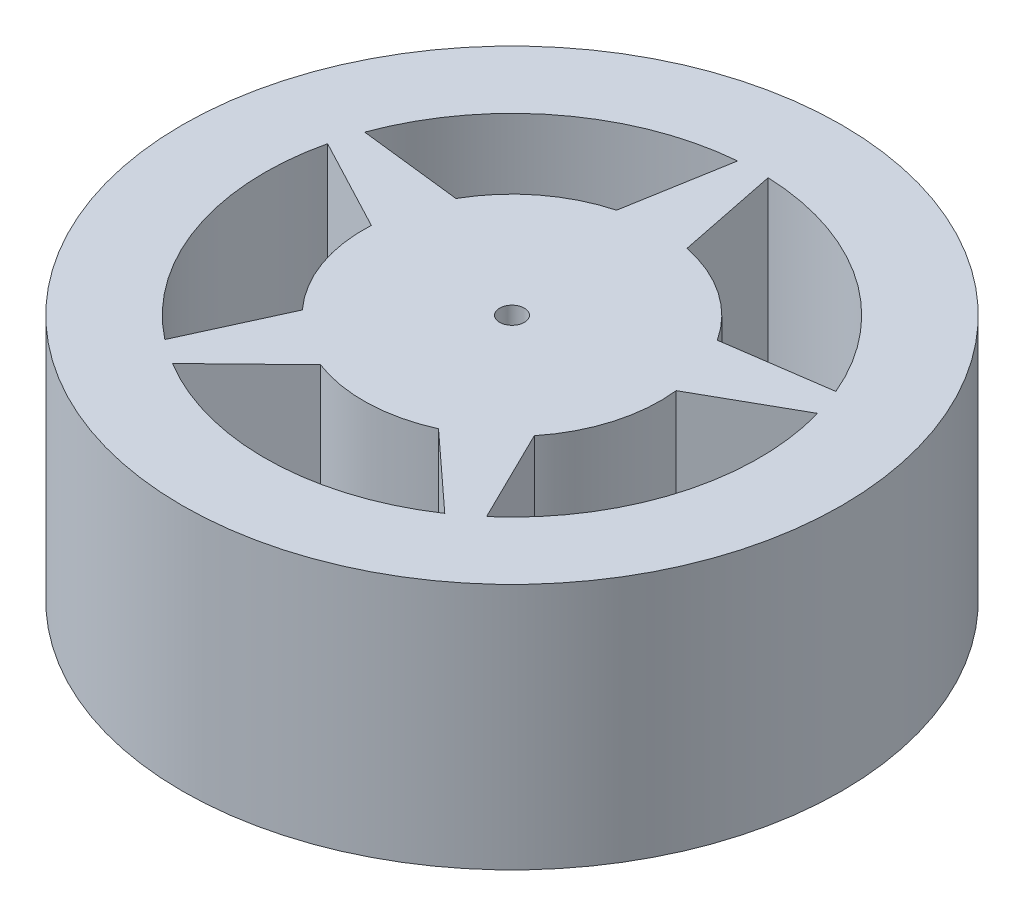
ISO-10303-21;
HEADER;
FILE_DESCRIPTION(('STEP AP214'),'2;1');
FILE_NAME('part.step','',(''),(''),'','','');
FILE_SCHEMA(('AUTOMOTIVE_DESIGN { 1 0 10303 214 1 1 1 1 }'));
ENDSEC;
DATA;
#1=APPLICATION_CONTEXT('core data for automotive mechanical design processes');
#2=APPLICATION_PROTOCOL_DEFINITION('international standard','automotive_design',2000,#1);
#3=PRODUCT_CONTEXT('',#1,'mechanical');
#4=PRODUCT('Part','Part','',(#3));
#5=PRODUCT_RELATED_PRODUCT_CATEGORY('part','',(#4));
#6=PRODUCT_DEFINITION_FORMATION('','',#4);
#7=PRODUCT_DEFINITION_CONTEXT('part definition',#1,'design');
#8=PRODUCT_DEFINITION('design','',#6,#7);
#9=PRODUCT_DEFINITION_SHAPE('','',#8);
#10=(LENGTH_UNIT() NAMED_UNIT(*) SI_UNIT(.MILLI.,.METRE.));
#11=(NAMED_UNIT(*) PLANE_ANGLE_UNIT() SI_UNIT($,.RADIAN.));
#12=(NAMED_UNIT(*) SI_UNIT($,.STERADIAN.) SOLID_ANGLE_UNIT());
#13=UNCERTAINTY_MEASURE_WITH_UNIT(LENGTH_MEASURE(1.E-05),#10,'distance_accuracy_value','');
#14=(GEOMETRIC_REPRESENTATION_CONTEXT(3) GLOBAL_UNCERTAINTY_ASSIGNED_CONTEXT((#13)) GLOBAL_UNIT_ASSIGNED_CONTEXT((#10,
#11,#12)) REPRESENTATION_CONTEXT('',''));
#15=CARTESIAN_POINT('',(0.,0.,0.));
#16=DIRECTION('',(0.,0.,1.));
#17=DIRECTION('',(1.,0.,0.));
#18=AXIS2_PLACEMENT_3D('',#15,#16,#17);
#19=CARTESIAN_POINT('',(0.,30.,0.));
#20=DIRECTION('',(0.,-1.,0.));
#21=DIRECTION('',(0.,0.,-1.));
#22=AXIS2_PLACEMENT_3D('',#19,#20,#21);
#23=CYLINDRICAL_SURFACE('',#22,40.);
#24=CARTESIAN_POINT('',(0.,30.,0.));
#25=DIRECTION('',(0.,1.,0.));
#26=DIRECTION('',(0.,0.,1.));
#27=AXIS2_PLACEMENT_3D('',#24,#25,#26);
#28=CIRCLE('',#27,40.);
#29=CARTESIAN_POINT('',(0.,30.,40.));
#30=VERTEX_POINT('',#29);
#31=EDGE_CURVE('E375',#30,#30,#28,.T.);
#32=ORIENTED_EDGE('',*,*,#31,.F.);
#33=EDGE_LOOP('',(#32));
#34=FACE_BOUND('',#33,.T.);
#35=CARTESIAN_POINT('',(0.,0.,0.));
#36=DIRECTION('',(0.,1.,0.));
#37=DIRECTION('',(0.,0.,1.));
#38=AXIS2_PLACEMENT_3D('',#35,#36,#37);
#39=CIRCLE('',#38,40.);
#40=CARTESIAN_POINT('',(0.,0.,40.));
#41=VERTEX_POINT('',#40);
#42=EDGE_CURVE('E365',#41,#41,#39,.T.);
#43=ORIENTED_EDGE('',*,*,#42,.T.);
#44=EDGE_LOOP('',(#43));
#45=FACE_BOUND('',#44,.T.);
#46=ADVANCED_FACE('F91',(#34,#45),#23,.T.);
#47=CARTESIAN_POINT('',(0.,30.,0.));
#48=DIRECTION('',(0.,1.,0.));
#49=DIRECTION('',(0.,0.,1.));
#50=AXIS2_PLACEMENT_3D('',#47,#48,#49);
#51=PLANE('',#50);
#52=CARTESIAN_POINT('',(0.,30.,0.));
#53=DIRECTION('',(0.,1.,0.));
#54=DIRECTION('',(0.,0.,1.));
#55=AXIS2_PLACEMENT_3D('',#52,#53,#54);
#56=CIRCLE('',#55,1.5);
#57=CARTESIAN_POINT('',(0.,30.,1.5));
#58=VERTEX_POINT('',#57);
#59=EDGE_CURVE('E766',#58,#58,#56,.T.);
#60=ORIENTED_EDGE('',*,*,#59,.F.);
#61=EDGE_LOOP('',(#60));
#62=FACE_BOUND('',#61,.T.);
#63=CARTESIAN_POINT('',(0.,30.,0.));
#64=DIRECTION('',(0.,1.,0.));
#65=DIRECTION('',(0.,0.,1.));
#66=AXIS2_PLACEMENT_3D('',#63,#64,#65);
#67=CIRCLE('',#66,29.9999999999999);
#68=CARTESIAN_POINT('',(27.6504964331646,30.,-11.6383008639378));
#69=VERTEX_POINT('',#68);
#70=CARTESIAN_POINT('',(1.09068254426184,30.,-29.9801669706432));
#71=VERTEX_POINT('',#70);
#72=EDGE_CURVE('E107',#69,#71,#67,.T.);
#73=ORIENTED_EDGE('',*,*,#72,.F.);
#74=DIRECTION('',(-0.989829319875597,0.,0.142260034846804));
#75=VECTOR('',#74,1.);
#76=CARTESIAN_POINT('',(27.6504964331646,30.,-11.6383008639378));
#77=LINE('',#76,#75);
#78=CARTESIAN_POINT('',(15.0779481878618,30.,-9.83135181163586));
#79=VERTEX_POINT('',#78);
#80=EDGE_CURVE('E298',#69,#79,#77,.T.);
#81=ORIENTED_EDGE('',*,*,#80,.T.);
#82=CARTESIAN_POINT('',(0.,30.,0.));
#83=DIRECTION('',(0.,1.,0.));
#84=DIRECTION('',(0.,0.,1.));
#85=AXIS2_PLACEMENT_3D('',#82,#83,#84);
#86=CIRCLE('',#85,18.);
#87=CARTESIAN_POINT('',(3.58921236170057,30.,-17.6385247292004));
#88=VERTEX_POINT('',#87);
#89=EDGE_CURVE('E311',#79,#88,#86,.T.);
#90=ORIENTED_EDGE('',*,*,#89,.T.);
#91=DIRECTION('',(0.198421798962708,0.,0.980116722485849));
#92=VECTOR('',#91,1.);
#93=CARTESIAN_POINT('',(1.09068254426184,30.,-29.9801669706432));
#94=LINE('',#93,#92);
#95=EDGE_CURVE('E315',#71,#88,#94,.T.);
#96=ORIENTED_EDGE('',*,*,#95,.F.);
#97=EDGE_LOOP('',(#73,#81,#90,#96));
#98=FACE_BOUND('',#97,.T.);
#99=CARTESIAN_POINT('',(0.,30.,0.));
#100=DIRECTION('',(0.,1.,0.));
#101=DIRECTION('',(0.,0.,1.));
#102=AXIS2_PLACEMENT_3D('',#99,#100,#101);
#103=CIRCLE('',#102,29.9999999999998);
#104=CARTESIAN_POINT('',(19.6131551760033,30.,22.7007520589517));
#105=VERTEX_POINT('',#104);
#106=CARTESIAN_POINT('',(28.8498725986917,30.,-8.22708034719749));
#107=VERTEX_POINT('',#106);
#108=EDGE_CURVE('E115',#105,#107,#103,.T.);
#109=ORIENTED_EDGE('',*,*,#108,.F.);
#110=DIRECTION('',(-0.441171414521584,0.,-0.897422856299651));
#111=VECTOR('',#110,1.);
#112=CARTESIAN_POINT('',(19.6131551760033,30.,22.7007520589517));
#113=LINE('',#112,#111);
#114=CARTESIAN_POINT('',(14.0095134348007,30.,11.3019260889522));
#115=VERTEX_POINT('',#114);
#116=EDGE_CURVE('E325',#105,#115,#113,.T.);
#117=ORIENTED_EDGE('',*,*,#116,.T.);
#118=CARTESIAN_POINT('',(0.,30.,0.));
#119=DIRECTION('',(0.,1.,0.));
#120=DIRECTION('',(0.,0.,1.));
#121=AXIS2_PLACEMENT_3D('',#118,#119,#120);
#122=CIRCLE('',#121,18.);
#123=CARTESIAN_POINT('',(17.8843614977254,30.,-2.03706009206327));
#124=VERTEX_POINT('',#123);
#125=EDGE_CURVE('E337',#115,#124,#122,.T.);
#126=ORIENTED_EDGE('',*,*,#125,.T.);
#127=DIRECTION('',(-0.87083068771609,0.,0.491583068597691));
#128=VECTOR('',#127,1.);
#129=CARTESIAN_POINT('',(28.8498725986917,30.,-8.22708034719749));
#130=LINE('',#129,#128);
#131=EDGE_CURVE('E341',#107,#124,#130,.T.);
#132=ORIENTED_EDGE('',*,*,#131,.F.);
#133=EDGE_LOOP('',(#109,#117,#126,#132));
#134=FACE_BOUND('',#133,.T.);
#135=CARTESIAN_POINT('',(0.,30.,0.));
#136=DIRECTION('',(0.,1.,0.));
#137=DIRECTION('',(0.,0.,1.));
#138=AXIS2_PLACEMENT_3D('',#135,#136,#137);
#139=CIRCLE('',#138,29.9999999999998);
#140=CARTESIAN_POINT('',(-29.2105431268995,30.,-6.83697083740547));
#141=VERTEX_POINT('',#140);
#142=CARTESIAN_POINT('',(-18.5042807203858,30.,23.6133774589986));
#143=VERTEX_POINT('',#142);
#144=EDGE_CURVE('E235',#141,#143,#139,.T.);
#145=ORIENTED_EDGE('',*,*,#144,.F.);
#146=DIRECTION('',(0.884407091783518,0.,0.466716290698128));
#147=VECTOR('',#146,1.);
#148=CARTESIAN_POINT('',(-29.2105431268995,30.,-6.83697083740547));
#149=LINE('',#148,#147);
#150=CARTESIAN_POINT('',(-17.9770399292636,30.,-0.908864886362832));
#151=VERTEX_POINT('',#150);
#152=EDGE_CURVE('E245',#141,#151,#149,.T.);
#153=ORIENTED_EDGE('',*,*,#152,.T.);
#154=CARTESIAN_POINT('',(0.,30.,0.));
#155=DIRECTION('',(0.,1.,0.));
#156=DIRECTION('',(0.,0.,1.));
#157=AXIS2_PLACEMENT_3D('',#154,#155,#156);
#158=CIRCLE('',#157,18.);
#159=CARTESIAN_POINT('',(-13.2713985050565,30.,12.1601801680725));
#160=VERTEX_POINT('',#159);
#161=EDGE_CURVE('E252',#151,#160,#158,.T.);
#162=ORIENTED_EDGE('',*,*,#161,.T.);
#163=DIRECTION('',(0.415571547587138,0.,-0.909560492125747));
#164=VECTOR('',#163,1.);
#165=CARTESIAN_POINT('',(-18.5042807203858,30.,23.6133774589986));
#166=LINE('',#165,#164);
#167=EDGE_CURVE('E259',#143,#160,#166,.T.);
#168=ORIENTED_EDGE('',*,*,#167,.F.);
#169=EDGE_LOOP('',(#145,#153,#162,#168));
#170=FACE_BOUND('',#169,.T.);
#171=CARTESIAN_POINT('',(0.,30.,0.));
#172=DIRECTION('',(0.,1.,0.));
#173=DIRECTION('',(0.,0.,1.));
#174=AXIS2_PLACEMENT_3D('',#171,#172,#173);
#175=CIRCLE('',#174,29.9999999999998);
#176=CARTESIAN_POINT('',(-15.5288999077687,30.,25.6681372065541));
#177=VERTEX_POINT('',#176);
#178=CARTESIAN_POINT('',(16.7395192928338,30.,24.8955516878986));
#179=VERTEX_POINT('',#178);
#180=EDGE_CURVE('E291',#177,#179,#175,.T.);
#181=ORIENTED_EDGE('',*,*,#180,.F.);
#182=DIRECTION('',(0.717170390836389,0.,-0.696897862321001));
#183=VECTOR('',#182,1.);
#184=CARTESIAN_POINT('',(-15.5288999077687,30.,25.6681372065541));
#185=LINE('',#184,#183);
#186=CARTESIAN_POINT('',(-6.41959271930667,30.,16.8163262729475));
#187=VERTEX_POINT('',#186);
#188=EDGE_CURVE('E274',#177,#187,#185,.T.);
#189=ORIENTED_EDGE('',*,*,#188,.T.);
#190=CARTESIAN_POINT('',(0.,30.,0.));
#191=DIRECTION('',(0.,1.,0.));
#192=DIRECTION('',(0.,0.,1.));
#193=AXIS2_PLACEMENT_3D('',#190,#191,#192);
#194=CIRCLE('',#193,18.);
#195=CARTESIAN_POINT('',(7.46393091098371,30.,16.3795523551794));
#196=VERTEX_POINT('',#195);
#197=EDGE_CURVE('E283',#187,#196,#194,.T.);
#198=ORIENTED_EDGE('',*,*,#197,.T.);
#199=DIRECTION('',(-0.736624762417696,0.,-0.676301677798505));
#200=VECTOR('',#199,1.);
#201=CARTESIAN_POINT('',(16.7395192928338,30.,24.8955516878986));
#202=LINE('',#201,#200);
#203=EDGE_CURVE('E287',#179,#196,#202,.T.);
#204=ORIENTED_EDGE('',*,*,#203,.F.);
#205=EDGE_LOOP('',(#181,#189,#198,#204));
#206=FACE_BOUND('',#205,.T.);
#207=CARTESIAN_POINT('',(0.,30.,0.));
#208=DIRECTION('',(0.,1.,0.));
#209=DIRECTION('',(0.,0.,1.));
#210=AXIS2_PLACEMENT_3D('',#207,#208,#209);
#211=CIRCLE('',#210,29.9999999999999);
#212=CARTESIAN_POINT('',(-2.5242085744998,30.,-29.8936175641628));
#213=VERTEX_POINT('',#212);
#214=CARTESIAN_POINT('',(-28.1757937154017,30.,-10.3016818290568));
#215=VERTEX_POINT('',#214);
#216=EDGE_CURVE('E321',#213,#215,#211,.T.);
#217=ORIENTED_EDGE('',*,*,#216,.F.);
#218=DIRECTION('',(-0.170576748222727,0.,0.985344393075721));
#219=VECTOR('',#218,1.);
#220=CARTESIAN_POINT('',(-2.5242085744998,30.,-29.8936175641628));
#221=LINE('',#220,#219);
#222=CARTESIAN_POINT('',(-4.69082897409221,30.,-17.3780356639011));
#223=VERTEX_POINT('',#222);
#224=EDGE_CURVE('E357',#213,#223,#221,.T.);
#225=ORIENTED_EDGE('',*,*,#224,.T.);
#226=CARTESIAN_POINT('',(0.,30.,0.));
#227=DIRECTION('',(0.,1.,0.));
#228=DIRECTION('',(0.,0.,1.));
#229=AXIS2_PLACEMENT_3D('',#226,#227,#228);
#230=CIRCLE('',#229,18.);
#231=CARTESIAN_POINT('',(-15.6661062653532,30.,-8.86414770198815));
#232=VERTEX_POINT('',#231);
#233=EDGE_CURVE('E353',#223,#232,#230,.T.);
#234=ORIENTED_EDGE('',*,*,#233,.T.);
#235=DIRECTION('',(0.993462103583941,0.,0.114162378840712));
#236=VECTOR('',#235,1.);
#237=CARTESIAN_POINT('',(-28.1757937154017,30.,-10.3016818290568));
#238=LINE('',#237,#236);
#239=EDGE_CURVE('E349',#215,#232,#238,.T.);
#240=ORIENTED_EDGE('',*,*,#239,.F.);
#241=EDGE_LOOP('',(#217,#225,#234,#240));
#242=FACE_BOUND('',#241,.T.);
#243=ORIENTED_EDGE('',*,*,#31,.T.);
#244=EDGE_LOOP('',(#243));
#245=FACE_BOUND('',#244,.T.);
#246=ADVANCED_FACE('F256',(#62,#98,#134,#170,#206,#242,#245),#51,.T.);
#247=CARTESIAN_POINT('',(0.,0.,0.));
#248=DIRECTION('',(0.,1.,0.));
#249=DIRECTION('',(0.,0.,1.));
#250=AXIS2_PLACEMENT_3D('',#247,#248,#249);
#251=PLANE('',#250);
#252=CARTESIAN_POINT('',(0.,0.,0.));
#253=DIRECTION('',(0.,1.,0.));
#254=DIRECTION('',(0.,0.,1.));
#255=AXIS2_PLACEMENT_3D('',#252,#253,#254);
#256=CIRCLE('',#255,1.5);
#257=CARTESIAN_POINT('',(0.,0.,1.5));
#258=VERTEX_POINT('',#257);
#259=EDGE_CURVE('E94',#258,#258,#256,.T.);
#260=ORIENTED_EDGE('',*,*,#259,.T.);
#261=EDGE_LOOP('',(#260));
#262=FACE_BOUND('',#261,.T.);
#263=DIRECTION('',(-0.989829319875597,0.,0.142260034846804));
#264=VECTOR('',#263,1.);
#265=CARTESIAN_POINT('',(-1.07923738042133,0.,-7.50921229140109));
#266=LINE('',#265,#264);
#267=CARTESIAN_POINT('',(27.6504964331646,0.,-11.6383008639378));
#268=VERTEX_POINT('',#267);
#269=CARTESIAN_POINT('',(15.0779481878618,0.,-9.83135181163586));
#270=VERTEX_POINT('',#269);
#271=EDGE_CURVE('E100',#268,#270,#266,.T.);
#272=ORIENTED_EDGE('',*,*,#271,.F.);
#273=CARTESIAN_POINT('',(0.,0.,0.));
#274=DIRECTION('',(0.,1.,0.));
#275=DIRECTION('',(0.,0.,1.));
#276=AXIS2_PLACEMENT_3D('',#273,#274,#275);
#277=CIRCLE('',#276,29.9999999999999);
#278=CARTESIAN_POINT('',(1.09068254426184,0.,-29.9801669706432));
#279=VERTEX_POINT('',#278);
#280=EDGE_CURVE('E12',#268,#279,#277,.T.);
#281=ORIENTED_EDGE('',*,*,#280,.T.);
#282=DIRECTION('',(0.198421798962708,0.,0.980116722485849));
#283=VECTOR('',#282,1.);
#284=CARTESIAN_POINT('',(6.8781796919143,0.,-1.39246760793647));
#285=LINE('',#284,#283);
#286=CARTESIAN_POINT('',(3.58921236170057,0.,-17.6385247292004));
#287=VERTEX_POINT('',#286);
#288=EDGE_CURVE('E440',#279,#287,#285,.T.);
#289=ORIENTED_EDGE('',*,*,#288,.T.);
#290=CARTESIAN_POINT('',(0.,0.,0.));
#291=DIRECTION('',(0.,1.,0.));
#292=DIRECTION('',(0.,0.,1.));
#293=AXIS2_PLACEMENT_3D('',#290,#291,#292);
#294=CIRCLE('',#293,18.);
#295=EDGE_CURVE('E444',#270,#287,#294,.T.);
#296=ORIENTED_EDGE('',*,*,#295,.F.);
#297=EDGE_LOOP('',(#272,#281,#289,#296));
#298=FACE_BOUND('',#297,.T.);
#299=DIRECTION('',(-0.441171414521584,0.,-0.897422856299651));
#300=VECTOR('',#299,1.);
#301=CARTESIAN_POINT('',(6.80818259046577,0.,-3.34688995569119));
#302=LINE('',#301,#300);
#303=CARTESIAN_POINT('',(19.6131551760033,0.,22.7007520589517));
#304=VERTEX_POINT('',#303);
#305=CARTESIAN_POINT('',(14.0095134348007,0.,11.3019260889522));
#306=VERTEX_POINT('',#305);
#307=EDGE_CURVE('E433',#304,#306,#302,.T.);
#308=ORIENTED_EDGE('',*,*,#307,.F.);
#309=CARTESIAN_POINT('',(0.,0.,0.));
#310=DIRECTION('',(0.,1.,0.));
#311=DIRECTION('',(0.,0.,1.));
#312=AXIS2_PLACEMENT_3D('',#309,#310,#311);
#313=CIRCLE('',#312,29.9999999999998);
#314=CARTESIAN_POINT('',(28.8498725986917,0.,-8.22708034719749));
#315=VERTEX_POINT('',#314);
#316=EDGE_CURVE('E436',#304,#315,#313,.T.);
#317=ORIENTED_EDGE('',*,*,#316,.T.);
#318=DIRECTION('',(-0.87083068771609,0.,0.491583068597691));
#319=VECTOR('',#318,1.);
#320=CARTESIAN_POINT('',(3.44978980742405,0.,6.11124146127508));
#321=LINE('',#320,#319);
#322=CARTESIAN_POINT('',(17.8843614977254,0.,-2.03706009206326));
#323=VERTEX_POINT('',#322);
#324=EDGE_CURVE('E425',#315,#323,#321,.T.);
#325=ORIENTED_EDGE('',*,*,#324,.T.);
#326=CARTESIAN_POINT('',(0.,0.,0.));
#327=DIRECTION('',(0.,1.,0.));
#328=DIRECTION('',(0.,0.,1.));
#329=AXIS2_PLACEMENT_3D('',#326,#327,#328);
#330=CIRCLE('',#329,18.);
#331=EDGE_CURVE('E429',#306,#323,#330,.T.);
#332=ORIENTED_EDGE('',*,*,#331,.F.);
#333=EDGE_LOOP('',(#308,#317,#325,#332));
#334=FACE_BOUND('',#333,.T.);
#335=DIRECTION('',(0.884407091783518,0.,0.466716290698128));
#336=VECTOR('',#335,1.);
#337=CARTESIAN_POINT('',(-3.54068285949337,0.,6.70944017404714));
#338=LINE('',#337,#336);
#339=CARTESIAN_POINT('',(-29.2105431268995,0.,-6.83697083740547));
#340=VERTEX_POINT('',#339);
#341=CARTESIAN_POINT('',(-17.9770399292636,0.,-0.908864886362832));
#342=VERTEX_POINT('',#341);
#343=EDGE_CURVE('E420',#340,#342,#338,.T.);
#344=ORIENTED_EDGE('',*,*,#343,.F.);
#345=CARTESIAN_POINT('',(0.,0.,0.));
#346=DIRECTION('',(0.,1.,0.));
#347=DIRECTION('',(0.,0.,1.));
#348=AXIS2_PLACEMENT_3D('',#345,#346,#347);
#349=CIRCLE('',#348,29.9999999999998);
#350=CARTESIAN_POINT('',(-18.5042807203858,0.,23.6133774589986));
#351=VERTEX_POINT('',#350);
#352=EDGE_CURVE('E238',#340,#351,#349,.T.);
#353=ORIENTED_EDGE('',*,*,#352,.T.);
#354=DIRECTION('',(0.415571547587138,0.,-0.909560492125747));
#355=VECTOR('',#354,1.);
#356=CARTESIAN_POINT('',(-6.38303618536332,0.,-2.91636262658758));
#357=LINE('',#356,#355);
#358=CARTESIAN_POINT('',(-13.2713985050565,0.,12.1601801680725));
#359=VERTEX_POINT('',#358);
#360=EDGE_CURVE('E412',#351,#359,#357,.T.);
#361=ORIENTED_EDGE('',*,*,#360,.T.);
#362=CARTESIAN_POINT('',(0.,0.,0.));
#363=DIRECTION('',(0.,1.,0.));
#364=DIRECTION('',(0.,0.,1.));
#365=AXIS2_PLACEMENT_3D('',#362,#363,#364);
#366=CIRCLE('',#365,18.);
#367=EDGE_CURVE('E416',#342,#359,#366,.T.);
#368=ORIENTED_EDGE('',*,*,#367,.F.);
#369=EDGE_LOOP('',(#344,#353,#361,#368));
#370=FACE_BOUND('',#369,.T.);
#371=DIRECTION('',(0.717170390836389,0.,-0.696897862321001));
#372=VECTOR('',#371,1.);
#373=CARTESIAN_POINT('',(5.28692562294449,0.,5.4407205421783));
#374=LINE('',#373,#372);
#375=CARTESIAN_POINT('',(-15.5288999077687,0.,25.6681372065541));
#376=VERTEX_POINT('',#375);
#377=CARTESIAN_POINT('',(-6.41959271930667,0.,16.8163262729475));
#378=VERTEX_POINT('',#377);
#379=EDGE_CURVE('E405',#376,#378,#374,.T.);
#380=ORIENTED_EDGE('',*,*,#379,.F.);
#381=CARTESIAN_POINT('',(0.,0.,0.));
#382=DIRECTION('',(0.,1.,0.));
#383=DIRECTION('',(0.,0.,1.));
#384=AXIS2_PLACEMENT_3D('',#381,#382,#383);
#385=CIRCLE('',#384,29.9999999999998);
#386=CARTESIAN_POINT('',(16.7395192928338,0.,24.8955516878986));
#387=VERTEX_POINT('',#386);
#388=EDGE_CURVE('E408',#376,#387,#385,.T.);
#389=ORIENTED_EDGE('',*,*,#388,.T.);
#390=DIRECTION('',(-0.736624762417696,0.,-0.676301677798505));
#391=VECTOR('',#390,1.);
#392=CARTESIAN_POINT('',(-4.74609233688327,0.,5.16942254446203));
#393=LINE('',#392,#391);
#394=CARTESIAN_POINT('',(7.46393091098371,0.,16.3795523551794));
#395=VERTEX_POINT('',#394);
#396=EDGE_CURVE('E397',#387,#395,#393,.T.);
#397=ORIENTED_EDGE('',*,*,#396,.T.);
#398=CARTESIAN_POINT('',(0.,0.,0.));
#399=DIRECTION('',(0.,1.,0.));
#400=DIRECTION('',(0.,0.,1.));
#401=AXIS2_PLACEMENT_3D('',#398,#399,#400);
#402=CIRCLE('',#401,18.);
#403=EDGE_CURVE('E401',#378,#395,#402,.T.);
#404=ORIENTED_EDGE('',*,*,#403,.F.);
#405=EDGE_LOOP('',(#380,#389,#397,#404));
#406=FACE_BOUND('',#405,.T.);
#407=DIRECTION('',(-0.170576748222727,0.,0.985344393075721));
#408=VECTOR('',#407,1.);
#409=CARTESIAN_POINT('',(-7.47518797349555,0.,-1.29405846913316));
#410=LINE('',#409,#408);
#411=CARTESIAN_POINT('',(-2.5242085744998,0.,-29.8936175641628));
#412=VERTEX_POINT('',#411);
#413=CARTESIAN_POINT('',(-4.69082897409221,0.,-17.3780356639011));
#414=VERTEX_POINT('',#413);
#415=EDGE_CURVE('E390',#412,#414,#410,.T.);
#416=ORIENTED_EDGE('',*,*,#415,.F.);
#417=CARTESIAN_POINT('',(0.,0.,0.));
#418=DIRECTION('',(0.,1.,0.));
#419=DIRECTION('',(0.,0.,1.));
#420=AXIS2_PLACEMENT_3D('',#417,#418,#419);
#421=CIRCLE('',#420,29.9999999999999);
#422=CARTESIAN_POINT('',(-28.1757937154017,0.,-10.3016818290568));
#423=VERTEX_POINT('',#422);
#424=EDGE_CURVE('E393',#412,#423,#421,.T.);
#425=ORIENTED_EDGE('',*,*,#424,.T.);
#426=DIRECTION('',(0.993462103583941,0.,0.114162378840712));
#427=VECTOR('',#426,1.);
#428=CARTESIAN_POINT('',(0.801159022908259,0.,-6.97183377121307));
#429=LINE('',#428,#427);
#430=CARTESIAN_POINT('',(-15.6661062653532,0.,-8.86414770198815));
#431=VERTEX_POINT('',#430);
#432=EDGE_CURVE('E379',#423,#431,#429,.T.);
#433=ORIENTED_EDGE('',*,*,#432,.T.);
#434=CARTESIAN_POINT('',(0.,0.,0.));
#435=DIRECTION('',(0.,1.,0.));
#436=DIRECTION('',(0.,0.,1.));
#437=AXIS2_PLACEMENT_3D('',#434,#435,#436);
#438=CIRCLE('',#437,18.);
#439=EDGE_CURVE('E386',#414,#431,#438,.T.);
#440=ORIENTED_EDGE('',*,*,#439,.F.);
#441=EDGE_LOOP('',(#416,#425,#433,#440));
#442=FACE_BOUND('',#441,.T.);
#443=ORIENTED_EDGE('',*,*,#42,.F.);
#444=EDGE_LOOP('',(#443));
#445=FACE_BOUND('',#444,.T.);
#446=ADVANCED_FACE('F460',(#262,#298,#334,#370,#406,#442,#445),#251,.F.);
#447=CARTESIAN_POINT('',(0.,-10.,0.));
#448=DIRECTION('',(0.,1.,0.));
#449=DIRECTION('',(0.,0.,1.));
#450=AXIS2_PLACEMENT_3D('',#447,#448,#449);
#451=CYLINDRICAL_SURFACE('',#450,29.9999999999999);
#452=DIRECTION('',(0.,1.,0.));
#453=VECTOR('',#452,1.);
#454=CARTESIAN_POINT('',(-2.5242085744998,-10.,-29.8936175641628));
#455=LINE('',#454,#453);
#456=EDGE_CURVE('E362',#412,#213,#455,.T.);
#457=ORIENTED_EDGE('',*,*,#456,.T.);
#458=ORIENTED_EDGE('',*,*,#216,.T.);
#459=DIRECTION('',(0.,1.,0.));
#460=VECTOR('',#459,1.);
#461=CARTESIAN_POINT('',(-28.1757937154017,-10.,-10.3016818290568));
#462=LINE('',#461,#460);
#463=EDGE_CURVE('E361',#423,#215,#462,.T.);
#464=ORIENTED_EDGE('',*,*,#463,.F.);
#465=ORIENTED_EDGE('',*,*,#424,.F.);
#466=EDGE_LOOP('',(#457,#458,#464,#465));
#467=FACE_BOUND('',#466,.T.);
#468=ADVANCED_FACE('F503',(#467),#451,.F.);
#469=CARTESIAN_POINT('',(-2.5242085744998,-10.,-29.8936175641628));
#470=DIRECTION('',(-0.985344393075721,0.,-0.170576748222727));
#471=DIRECTION('',(-0.170576748222727,0.,0.985344393075721));
#472=AXIS2_PLACEMENT_3D('',#469,#470,#471);
#473=PLANE('',#472);
#474=ORIENTED_EDGE('',*,*,#415,.T.);
#475=DIRECTION('',(0.,1.,0.));
#476=VECTOR('',#475,1.);
#477=CARTESIAN_POINT('',(-4.69082897409221,-10.,-17.3780356639011));
#478=LINE('',#477,#476);
#479=EDGE_CURVE('E366',#414,#223,#478,.T.);
#480=ORIENTED_EDGE('',*,*,#479,.T.);
#481=ORIENTED_EDGE('',*,*,#224,.F.);
#482=ORIENTED_EDGE('',*,*,#456,.F.);
#483=EDGE_LOOP('',(#474,#480,#481,#482));
#484=FACE_BOUND('',#483,.T.);
#485=ADVANCED_FACE('F508',(#484),#473,.T.);
#486=CARTESIAN_POINT('',(0.,-10.,0.));
#487=DIRECTION('',(0.,1.,0.));
#488=DIRECTION('',(0.,0.,1.));
#489=AXIS2_PLACEMENT_3D('',#486,#487,#488);
#490=CYLINDRICAL_SURFACE('',#489,18.);
#491=ORIENTED_EDGE('',*,*,#439,.T.);
#492=DIRECTION('',(0.,1.,0.));
#493=VECTOR('',#492,1.);
#494=CARTESIAN_POINT('',(-15.6661062653532,-10.,-8.86414770198815));
#495=LINE('',#494,#493);
#496=EDGE_CURVE('E369',#431,#232,#495,.T.);
#497=ORIENTED_EDGE('',*,*,#496,.T.);
#498=ORIENTED_EDGE('',*,*,#233,.F.);
#499=ORIENTED_EDGE('',*,*,#479,.F.);
#500=EDGE_LOOP('',(#491,#497,#498,#499));
#501=FACE_BOUND('',#500,.T.);
#502=ADVANCED_FACE('F517',(#501),#490,.T.);
#503=CARTESIAN_POINT('',(-28.1757937154017,-10.,-10.3016818290568));
#504=DIRECTION('',(-0.114162378840712,0.,0.993462103583941));
#505=DIRECTION('',(0.993462103583941,0.,0.114162378840712));
#506=AXIS2_PLACEMENT_3D('',#503,#504,#505);
#507=PLANE('',#506);
#508=ORIENTED_EDGE('',*,*,#463,.T.);
#509=ORIENTED_EDGE('',*,*,#239,.T.);
#510=ORIENTED_EDGE('',*,*,#496,.F.);
#511=ORIENTED_EDGE('',*,*,#432,.F.);
#512=EDGE_LOOP('',(#508,#509,#510,#511));
#513=FACE_BOUND('',#512,.T.);
#514=ADVANCED_FACE('F513',(#513),#507,.F.);
#515=CARTESIAN_POINT('',(0.,-10.,0.));
#516=DIRECTION('',(0.,1.,0.));
#517=DIRECTION('',(0.,0.,1.));
#518=AXIS2_PLACEMENT_3D('',#515,#516,#517);
#519=CYLINDRICAL_SURFACE('',#518,29.9999999999998);
#520=DIRECTION('',(0.,1.,0.));
#521=VECTOR('',#520,1.);
#522=CARTESIAN_POINT('',(-15.5288999077687,-10.,25.6681372065541));
#523=LINE('',#522,#521);
#524=EDGE_CURVE('E261',#376,#177,#523,.T.);
#525=ORIENTED_EDGE('',*,*,#524,.T.);
#526=ORIENTED_EDGE('',*,*,#180,.T.);
#527=DIRECTION('',(0.,1.,0.));
#528=VECTOR('',#527,1.);
#529=CARTESIAN_POINT('',(16.7395192928338,-10.,24.8955516878986));
#530=LINE('',#529,#528);
#531=EDGE_CURVE('E270',#387,#179,#530,.T.);
#532=ORIENTED_EDGE('',*,*,#531,.F.);
#533=ORIENTED_EDGE('',*,*,#388,.F.);
#534=EDGE_LOOP('',(#525,#526,#532,#533));
#535=FACE_BOUND('',#534,.T.);
#536=ADVANCED_FACE('F516',(#535),#519,.F.);
#537=CARTESIAN_POINT('',(-15.5288999077687,-10.,25.6681372065541));
#538=DIRECTION('',(0.696897862321001,0.,0.717170390836389));
#539=DIRECTION('',(0.717170390836389,0.,-0.696897862321001));
#540=AXIS2_PLACEMENT_3D('',#537,#538,#539);
#541=PLANE('',#540);
#542=ORIENTED_EDGE('',*,*,#379,.T.);
#543=DIRECTION('',(0.,1.,0.));
#544=VECTOR('',#543,1.);
#545=CARTESIAN_POINT('',(-6.41959271930667,-10.,16.8163262729475));
#546=LINE('',#545,#544);
#547=EDGE_CURVE('E265',#378,#187,#546,.T.);
#548=ORIENTED_EDGE('',*,*,#547,.T.);
#549=ORIENTED_EDGE('',*,*,#188,.F.);
#550=ORIENTED_EDGE('',*,*,#524,.F.);
#551=EDGE_LOOP('',(#542,#548,#549,#550));
#552=FACE_BOUND('',#551,.T.);
#553=ADVANCED_FACE('F554',(#552),#541,.T.);
#554=CARTESIAN_POINT('',(0.,-10.,0.));
#555=DIRECTION('',(0.,1.,0.));
#556=DIRECTION('',(0.,0.,1.));
#557=AXIS2_PLACEMENT_3D('',#554,#555,#556);
#558=CYLINDRICAL_SURFACE('',#557,18.);
#559=ORIENTED_EDGE('',*,*,#403,.T.);
#560=DIRECTION('',(0.,1.,0.));
#561=VECTOR('',#560,1.);
#562=CARTESIAN_POINT('',(7.46393091098371,-10.,16.3795523551794));
#563=LINE('',#562,#561);
#564=EDGE_CURVE('E275',#395,#196,#563,.T.);
#565=ORIENTED_EDGE('',*,*,#564,.T.);
#566=ORIENTED_EDGE('',*,*,#197,.F.);
#567=ORIENTED_EDGE('',*,*,#547,.F.);
#568=EDGE_LOOP('',(#559,#565,#566,#567));
#569=FACE_BOUND('',#568,.T.);
#570=ADVANCED_FACE('F562',(#569),#558,.T.);
#571=CARTESIAN_POINT('',(16.7395192928338,-10.,24.8955516878986));
#572=DIRECTION('',(0.676301677798505,0.,-0.736624762417696));
#573=DIRECTION('',(-0.736624762417696,0.,-0.676301677798505));
#574=AXIS2_PLACEMENT_3D('',#571,#572,#573);
#575=PLANE('',#574);
#576=ORIENTED_EDGE('',*,*,#531,.T.);
#577=ORIENTED_EDGE('',*,*,#203,.T.);
#578=ORIENTED_EDGE('',*,*,#564,.F.);
#579=ORIENTED_EDGE('',*,*,#396,.F.);
#580=EDGE_LOOP('',(#576,#577,#578,#579));
#581=FACE_BOUND('',#580,.T.);
#582=ADVANCED_FACE('F570',(#581),#575,.F.);
#583=CARTESIAN_POINT('',(0.,-10.,0.));
#584=DIRECTION('',(0.,1.,0.));
#585=DIRECTION('',(0.,0.,1.));
#586=AXIS2_PLACEMENT_3D('',#583,#584,#585);
#587=CYLINDRICAL_SURFACE('',#586,29.9999999999998);
#588=DIRECTION('',(0.,1.,0.));
#589=VECTOR('',#588,1.);
#590=CARTESIAN_POINT('',(-29.2105431268995,-10.,-6.83697083740547));
#591=LINE('',#590,#589);
#592=EDGE_CURVE('E230',#340,#141,#591,.T.);
#593=ORIENTED_EDGE('',*,*,#592,.T.);
#594=ORIENTED_EDGE('',*,*,#144,.T.);
#595=DIRECTION('',(0.,1.,0.));
#596=VECTOR('',#595,1.);
#597=CARTESIAN_POINT('',(-18.5042807203858,-10.,23.6133774589986));
#598=LINE('',#597,#596);
#599=EDGE_CURVE('E253',#351,#143,#598,.T.);
#600=ORIENTED_EDGE('',*,*,#599,.F.);
#601=ORIENTED_EDGE('',*,*,#352,.F.);
#602=EDGE_LOOP('',(#593,#594,#600,#601));
#603=FACE_BOUND('',#602,.T.);
#604=ADVANCED_FACE('F232',(#603),#587,.F.);
#605=CARTESIAN_POINT('',(-29.2105431268995,-10.,-6.83697083740547));
#606=DIRECTION('',(-0.466716290698128,0.,0.884407091783518));
#607=DIRECTION('',(0.884407091783518,0.,0.466716290698128));
#608=AXIS2_PLACEMENT_3D('',#605,#606,#607);
#609=PLANE('',#608);
#610=ORIENTED_EDGE('',*,*,#343,.T.);
#611=DIRECTION('',(0.,1.,0.));
#612=VECTOR('',#611,1.);
#613=CARTESIAN_POINT('',(-17.9770399292636,-10.,-0.908864886362832));
#614=LINE('',#613,#612);
#615=EDGE_CURVE('E242',#342,#151,#614,.T.);
#616=ORIENTED_EDGE('',*,*,#615,.T.);
#617=ORIENTED_EDGE('',*,*,#152,.F.);
#618=ORIENTED_EDGE('',*,*,#592,.F.);
#619=EDGE_LOOP('',(#610,#616,#617,#618));
#620=FACE_BOUND('',#619,.T.);
#621=ADVANCED_FACE('F246',(#620),#609,.T.);
#622=CARTESIAN_POINT('',(0.,-10.,0.));
#623=DIRECTION('',(0.,1.,0.));
#624=DIRECTION('',(0.,0.,1.));
#625=AXIS2_PLACEMENT_3D('',#622,#623,#624);
#626=CYLINDRICAL_SURFACE('',#625,18.);
#627=ORIENTED_EDGE('',*,*,#367,.T.);
#628=DIRECTION('',(0.,1.,0.));
#629=VECTOR('',#628,1.);
#630=CARTESIAN_POINT('',(-13.2713985050565,-10.,12.1601801680725));
#631=LINE('',#630,#629);
#632=EDGE_CURVE('E774',#359,#160,#631,.T.);
#633=ORIENTED_EDGE('',*,*,#632,.T.);
#634=ORIENTED_EDGE('',*,*,#161,.F.);
#635=ORIENTED_EDGE('',*,*,#615,.F.);
#636=EDGE_LOOP('',(#627,#633,#634,#635));
#637=FACE_BOUND('',#636,.T.);
#638=ADVANCED_FACE('F591',(#637),#626,.T.);
#639=CARTESIAN_POINT('',(-18.5042807203858,-10.,23.6133774589986));
#640=DIRECTION('',(0.909560492125747,0.,0.415571547587138));
#641=DIRECTION('',(0.415571547587138,0.,-0.909560492125747));
#642=AXIS2_PLACEMENT_3D('',#639,#640,#641);
#643=PLANE('',#642);
#644=ORIENTED_EDGE('',*,*,#599,.T.);
#645=ORIENTED_EDGE('',*,*,#167,.T.);
#646=ORIENTED_EDGE('',*,*,#632,.F.);
#647=ORIENTED_EDGE('',*,*,#360,.F.);
#648=EDGE_LOOP('',(#644,#645,#646,#647));
#649=FACE_BOUND('',#648,.T.);
#650=ADVANCED_FACE('F598',(#649),#643,.F.);
#651=CARTESIAN_POINT('',(0.,-10.,0.));
#652=DIRECTION('',(0.,1.,0.));
#653=DIRECTION('',(0.,0.,1.));
#654=AXIS2_PLACEMENT_3D('',#651,#652,#653);
#655=CYLINDRICAL_SURFACE('',#654,29.9999999999998);
#656=DIRECTION('',(0.,1.,0.));
#657=VECTOR('',#656,1.);
#658=CARTESIAN_POINT('',(19.6131551760033,-10.,22.7007520589517));
#659=LINE('',#658,#657);
#660=EDGE_CURVE('E294',#304,#105,#659,.T.);
#661=ORIENTED_EDGE('',*,*,#660,.T.);
#662=ORIENTED_EDGE('',*,*,#108,.T.);
#663=DIRECTION('',(0.,1.,0.));
#664=VECTOR('',#663,1.);
#665=CARTESIAN_POINT('',(28.8498725986917,-10.,-8.22708034719749));
#666=LINE('',#665,#664);
#667=EDGE_CURVE('E322',#315,#107,#666,.T.);
#668=ORIENTED_EDGE('',*,*,#667,.F.);
#669=ORIENTED_EDGE('',*,*,#316,.F.);
#670=EDGE_LOOP('',(#661,#662,#668,#669));
#671=FACE_BOUND('',#670,.T.);
#672=ADVANCED_FACE('F476',(#671),#655,.F.);
#673=CARTESIAN_POINT('',(19.6131551760033,-10.,22.7007520589517));
#674=DIRECTION('',(0.897422856299651,0.,-0.441171414521584));
#675=DIRECTION('',(-0.441171414521584,0.,-0.897422856299651));
#676=AXIS2_PLACEMENT_3D('',#673,#674,#675);
#677=PLANE('',#676);
#678=ORIENTED_EDGE('',*,*,#307,.T.);
#679=DIRECTION('',(0.,1.,0.));
#680=VECTOR('',#679,1.);
#681=CARTESIAN_POINT('',(14.0095134348007,-10.,11.3019260889522));
#682=LINE('',#681,#680);
#683=EDGE_CURVE('E329',#306,#115,#682,.T.);
#684=ORIENTED_EDGE('',*,*,#683,.T.);
#685=ORIENTED_EDGE('',*,*,#116,.F.);
#686=ORIENTED_EDGE('',*,*,#660,.F.);
#687=EDGE_LOOP('',(#678,#684,#685,#686));
#688=FACE_BOUND('',#687,.T.);
#689=ADVANCED_FACE('F483',(#688),#677,.T.);
#690=CARTESIAN_POINT('',(0.,-10.,0.));
#691=DIRECTION('',(0.,1.,0.));
#692=DIRECTION('',(0.,0.,1.));
#693=AXIS2_PLACEMENT_3D('',#690,#691,#692);
#694=CYLINDRICAL_SURFACE('',#693,18.);
#695=ORIENTED_EDGE('',*,*,#331,.T.);
#696=DIRECTION('',(0.,1.,0.));
#697=VECTOR('',#696,1.);
#698=CARTESIAN_POINT('',(17.8843614977254,-10.,-2.03706009206327));
#699=LINE('',#698,#697);
#700=EDGE_CURVE('E326',#323,#124,#699,.T.);
#701=ORIENTED_EDGE('',*,*,#700,.T.);
#702=ORIENTED_EDGE('',*,*,#125,.F.);
#703=ORIENTED_EDGE('',*,*,#683,.F.);
#704=EDGE_LOOP('',(#695,#701,#702,#703));
#705=FACE_BOUND('',#704,.T.);
#706=ADVANCED_FACE('F485',(#705),#694,.T.);
#707=CARTESIAN_POINT('',(28.8498725986917,-10.,-8.22708034719749));
#708=DIRECTION('',(-0.491583068597691,0.,-0.87083068771609));
#709=DIRECTION('',(-0.87083068771609,0.,0.491583068597691));
#710=AXIS2_PLACEMENT_3D('',#707,#708,#709);
#711=PLANE('',#710);
#712=ORIENTED_EDGE('',*,*,#667,.T.);
#713=ORIENTED_EDGE('',*,*,#131,.T.);
#714=ORIENTED_EDGE('',*,*,#700,.F.);
#715=ORIENTED_EDGE('',*,*,#324,.F.);
#716=EDGE_LOOP('',(#712,#713,#714,#715));
#717=FACE_BOUND('',#716,.T.);
#718=ADVANCED_FACE('F475',(#717),#711,.F.);
#719=CARTESIAN_POINT('',(0.,-10.,0.));
#720=DIRECTION('',(0.,1.,0.));
#721=DIRECTION('',(0.,0.,1.));
#722=AXIS2_PLACEMENT_3D('',#719,#720,#721);
#723=CYLINDRICAL_SURFACE('',#722,29.9999999999999);
#724=DIRECTION('',(0.,1.,0.));
#725=VECTOR('',#724,1.);
#726=CARTESIAN_POINT('',(27.6504964331646,-10.,-11.6383008639378));
#727=LINE('',#726,#725);
#728=EDGE_CURVE('E305',#268,#69,#727,.T.);
#729=ORIENTED_EDGE('',*,*,#728,.T.);
#730=ORIENTED_EDGE('',*,*,#72,.T.);
#731=DIRECTION('',(0.,1.,0.));
#732=VECTOR('',#731,1.);
#733=CARTESIAN_POINT('',(1.09068254426184,-10.,-29.9801669706432));
#734=LINE('',#733,#732);
#735=EDGE_CURVE('E295',#279,#71,#734,.T.);
#736=ORIENTED_EDGE('',*,*,#735,.F.);
#737=ORIENTED_EDGE('',*,*,#280,.F.);
#738=EDGE_LOOP('',(#729,#730,#736,#737));
#739=FACE_BOUND('',#738,.T.);
#740=ADVANCED_FACE('F465',(#739),#723,.F.);
#741=CARTESIAN_POINT('',(27.6504964331646,-10.,-11.6383008639378));
#742=DIRECTION('',(-0.142260034846804,0.,-0.989829319875597));
#743=DIRECTION('',(-0.989829319875597,0.,0.142260034846804));
#744=AXIS2_PLACEMENT_3D('',#741,#742,#743);
#745=PLANE('',#744);
#746=ORIENTED_EDGE('',*,*,#271,.T.);
#747=DIRECTION('',(0.,1.,0.));
#748=VECTOR('',#747,1.);
#749=CARTESIAN_POINT('',(15.0779481878618,-10.,-9.83135181163586));
#750=LINE('',#749,#748);
#751=EDGE_CURVE('E302',#270,#79,#750,.T.);
#752=ORIENTED_EDGE('',*,*,#751,.T.);
#753=ORIENTED_EDGE('',*,*,#80,.F.);
#754=ORIENTED_EDGE('',*,*,#728,.F.);
#755=EDGE_LOOP('',(#746,#752,#753,#754));
#756=FACE_BOUND('',#755,.T.);
#757=ADVANCED_FACE('F453',(#756),#745,.T.);
#758=CARTESIAN_POINT('',(0.,-10.,0.));
#759=DIRECTION('',(0.,1.,0.));
#760=DIRECTION('',(0.,0.,1.));
#761=AXIS2_PLACEMENT_3D('',#758,#759,#760);
#762=CYLINDRICAL_SURFACE('',#761,18.);
#763=ORIENTED_EDGE('',*,*,#295,.T.);
#764=DIRECTION('',(0.,1.,0.));
#765=VECTOR('',#764,1.);
#766=CARTESIAN_POINT('',(3.58921236170057,-10.,-17.6385247292004));
#767=LINE('',#766,#765);
#768=EDGE_CURVE('E299',#287,#88,#767,.T.);
#769=ORIENTED_EDGE('',*,*,#768,.T.);
#770=ORIENTED_EDGE('',*,*,#89,.F.);
#771=ORIENTED_EDGE('',*,*,#751,.F.);
#772=EDGE_LOOP('',(#763,#769,#770,#771));
#773=FACE_BOUND('',#772,.T.);
#774=ADVANCED_FACE('F459',(#773),#762,.T.);
#775=CARTESIAN_POINT('',(1.09068254426184,-10.,-29.9801669706432));
#776=DIRECTION('',(-0.980116722485849,0.,0.198421798962708));
#777=DIRECTION('',(0.198421798962708,0.,0.980116722485849));
#778=AXIS2_PLACEMENT_3D('',#775,#776,#777);
#779=PLANE('',#778);
#780=ORIENTED_EDGE('',*,*,#735,.T.);
#781=ORIENTED_EDGE('',*,*,#95,.T.);
#782=ORIENTED_EDGE('',*,*,#768,.F.);
#783=ORIENTED_EDGE('',*,*,#288,.F.);
#784=EDGE_LOOP('',(#780,#781,#782,#783));
#785=FACE_BOUND('',#784,.T.);
#786=ADVANCED_FACE('F463',(#785),#779,.F.);
#787=CARTESIAN_POINT('',(0.,-10.,0.));
#788=DIRECTION('',(0.,1.,0.));
#789=DIRECTION('',(0.,0.,1.));
#790=AXIS2_PLACEMENT_3D('',#787,#788,#789);
#791=CYLINDRICAL_SURFACE('',#790,1.5);
#792=ORIENTED_EDGE('',*,*,#59,.T.);
#793=EDGE_LOOP('',(#792));
#794=FACE_BOUND('',#793,.T.);
#795=ORIENTED_EDGE('',*,*,#259,.F.);
#796=EDGE_LOOP('',(#795));
#797=FACE_BOUND('',#796,.T.);
#798=ADVANCED_FACE('F666',(#794,#797),#791,.F.);
#799=CLOSED_SHELL('',(#46,#246,#446,#468,#485,#502,#514,#536,#553,#570,#582,#604,#621,#638,#650,
#672,#689,#706,#718,#740,#757,#774,#786,#798));
#800=MANIFOLD_SOLID_BREP('B2',#799);
#801=ADVANCED_BREP_SHAPE_REPRESENTATION('',(#18,#800),#14);
#802=SHAPE_DEFINITION_REPRESENTATION(#9,#801);
ENDSEC;
END-ISO-10303-21;
